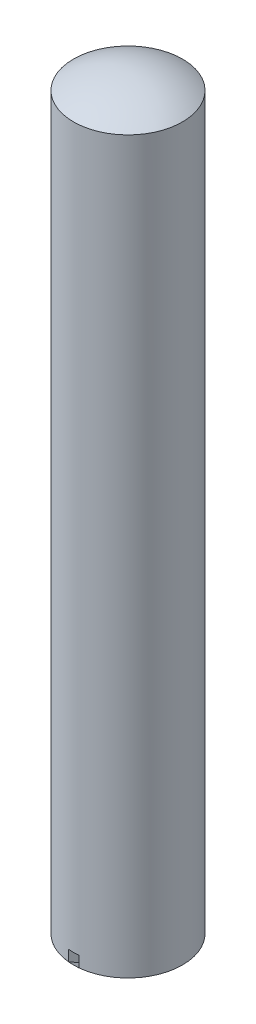
ISO-10303-21;
HEADER;
FILE_DESCRIPTION(('STEP AP214'),'2;1');
FILE_NAME('part.step','',(''),(''),'','','');
FILE_SCHEMA(('AUTOMOTIVE_DESIGN { 1 0 10303 214 1 1 1 1 }'));
ENDSEC;
DATA;
#1=APPLICATION_CONTEXT('core data for automotive mechanical design processes');
#2=APPLICATION_PROTOCOL_DEFINITION('international standard','automotive_design',2000,#1);
#3=PRODUCT_CONTEXT('',#1,'mechanical');
#4=PRODUCT('Part','Part','',(#3));
#5=PRODUCT_RELATED_PRODUCT_CATEGORY('part','',(#4));
#6=PRODUCT_DEFINITION_FORMATION('','',#4);
#7=PRODUCT_DEFINITION_CONTEXT('part definition',#1,'design');
#8=PRODUCT_DEFINITION('design','',#6,#7);
#9=PRODUCT_DEFINITION_SHAPE('','',#8);
#10=(LENGTH_UNIT() NAMED_UNIT(*) SI_UNIT(.MILLI.,.METRE.));
#11=(NAMED_UNIT(*) PLANE_ANGLE_UNIT() SI_UNIT($,.RADIAN.));
#12=(NAMED_UNIT(*) SI_UNIT($,.STERADIAN.) SOLID_ANGLE_UNIT());
#13=UNCERTAINTY_MEASURE_WITH_UNIT(LENGTH_MEASURE(1.E-05),#10,'distance_accuracy_value','');
#14=(GEOMETRIC_REPRESENTATION_CONTEXT(3) GLOBAL_UNCERTAINTY_ASSIGNED_CONTEXT((#13)) GLOBAL_UNIT_ASSIGNED_CONTEXT((#10,
#11,#12)) REPRESENTATION_CONTEXT('',''));
#15=CARTESIAN_POINT('',(0.,0.,0.));
#16=DIRECTION('',(0.,0.,1.));
#17=DIRECTION('',(1.,0.,0.));
#18=AXIS2_PLACEMENT_3D('',#15,#16,#17);
#19=CARTESIAN_POINT('',(0.,5.,0.));
#20=DIRECTION('',(0.,1.,0.));
#21=DIRECTION('',(0.,0.,1.));
#22=AXIS2_PLACEMENT_3D('',#19,#20,#21);
#23=PLANE('',#22);
#24=DIRECTION('',(0.,0.,1.));
#25=VECTOR('',#24,1.);
#26=CARTESIAN_POINT('',(-0.999999999999995,5.,9.9498743710662));
#27=LINE('',#26,#25);
#28=CARTESIAN_POINT('',(-0.999999999999994,5.,-9.9498743710662));
#29=VERTEX_POINT('',#28);
#30=CARTESIAN_POINT('',(-0.999999999999995,5.,9.9498743710662));
#31=VERTEX_POINT('',#30);
#32=EDGE_CURVE('P0_E64',#29,#31,#27,.T.);
#33=ORIENTED_EDGE('',*,*,#32,.F.);
#34=CARTESIAN_POINT('',(0.,5.,0.));
#35=DIRECTION('',(0.,1.,0.));
#36=DIRECTION('',(0.,0.,1.));
#37=AXIS2_PLACEMENT_3D('',#34,#35,#36);
#38=CIRCLE('',#37,10.);
#39=CARTESIAN_POINT('',(0.999999999999997,5.,-9.9498743710662));
#40=VERTEX_POINT('',#39);
#41=EDGE_CURVE('P0_E98',#40,#29,#38,.T.);
#42=ORIENTED_EDGE('',*,*,#41,.F.);
#43=DIRECTION('',(0.,0.,-1.));
#44=VECTOR('',#43,1.);
#45=CARTESIAN_POINT('',(0.999999999999997,5.,9.9498743710662));
#46=LINE('',#45,#44);
#47=CARTESIAN_POINT('',(0.999999999999997,5.,9.9498743710662));
#48=VERTEX_POINT('',#47);
#49=EDGE_CURVE('P0_E118',#48,#40,#46,.T.);
#50=ORIENTED_EDGE('',*,*,#49,.F.);
#51=EDGE_CURVE('P0_E71',#31,#48,#38,.T.);
#52=ORIENTED_EDGE('',*,*,#51,.F.);
#53=EDGE_LOOP('',(#33,#42,#50,#52));
#54=FACE_BOUND('',#53,.T.);
#55=ADVANCED_FACE('P0_F46',(#54),#23,.F.);
#56=CARTESIAN_POINT('',(0.,18.1666666666663,0.));
#57=DIRECTION('',(-1.,0.,0.));
#58=DIRECTION('',(0.,0.,1.));
#59=AXIS2_PLACEMENT_3D('',#56,#57,#58);
#60=SPHERICAL_SURFACE('',#59,18.1666666666663);
#61=CARTESIAN_POINT('',(0.999999999999995,18.1666666666663,0.));
#62=DIRECTION('',(-1.,0.,0.));
#63=DIRECTION('',(0.,-1.,0.));
#64=AXIS2_PLACEMENT_3D('',#61,#62,#63);
#65=CIRCLE('',#64,18.1391228502859);
#66=CARTESIAN_POINT('',(0.999999999999995,3.00000000000008,9.9498743710662));
#67=VERTEX_POINT('',#66);
#68=CARTESIAN_POINT('',(0.999999999999998,3.00000000000008,-9.9498743710662));
#69=VERTEX_POINT('',#68);
#70=EDGE_CURVE('P0_E140',#67,#69,#65,.F.);
#71=ORIENTED_EDGE('',*,*,#70,.T.);
#72=CARTESIAN_POINT('',(0.,3.00000000000009,0.));
#73=DIRECTION('',(0.,1.,0.));
#74=DIRECTION('',(-1.,0.,0.));
#75=AXIS2_PLACEMENT_3D('',#72,#73,#74);
#76=CIRCLE('',#75,10.);
#77=EDGE_CURVE('P0_E51',#67,#69,#76,.T.);
#78=ORIENTED_EDGE('',*,*,#77,.F.);
#79=EDGE_LOOP('',(#71,#78));
#80=FACE_BOUND('',#79,.T.);
#81=ADVANCED_FACE('P0_F48',(#80),#60,.T.);
#82=CARTESIAN_POINT('',(0.,121.833333333334,0.));
#83=DIRECTION('',(-1.,0.,0.));
#84=DIRECTION('',(0.,0.,1.));
#85=AXIS2_PLACEMENT_3D('',#82,#83,#84);
#86=SPHERICAL_SURFACE('',#85,18.1666666666663);
#87=CARTESIAN_POINT('',(0.,137.,0.));
#88=DIRECTION('',(0.,1.,0.));
#89=DIRECTION('',(-1.,0.,0.));
#90=AXIS2_PLACEMENT_3D('',#87,#88,#89);
#91=CIRCLE('',#90,10.);
#92=CARTESIAN_POINT('',(-10.,137.,0.));
#93=VERTEX_POINT('',#92);
#94=EDGE_CURVE('P0_E12',#93,#93,#91,.F.);
#95=ORIENTED_EDGE('',*,*,#94,.F.);
#96=EDGE_LOOP('',(#95));
#97=FACE_BOUND('',#96,.T.);
#98=ADVANCED_FACE('P0_F131',(#97),#86,.T.);
#99=CARTESIAN_POINT('',(0.,3.00000000000006,0.));
#100=DIRECTION('',(0.,1.,0.));
#101=DIRECTION('',(-1.,0.,0.));
#102=AXIS2_PLACEMENT_3D('',#99,#100,#101);
#103=CYLINDRICAL_SURFACE('',#102,10.);
#104=DIRECTION('',(0.,1.,0.));
#105=VECTOR('',#104,1.);
#106=CARTESIAN_POINT('',(0.999999999999997,-0.000999999999996663,-9.9498743710662));
#107=LINE('',#106,#105);
#108=EDGE_CURVE('P0_E141',#69,#40,#107,.T.);
#109=ORIENTED_EDGE('',*,*,#108,.T.);
#110=ORIENTED_EDGE('',*,*,#41,.T.);
#111=DIRECTION('',(0.,1.,0.));
#112=VECTOR('',#111,1.);
#113=CARTESIAN_POINT('',(-0.999999999999994,-0.00100000000000013,-9.9498743710662));
#114=LINE('',#113,#112);
#115=CARTESIAN_POINT('',(-0.999999999999994,3.00000000000007,-9.9498743710662));
#116=VERTEX_POINT('',#115);
#117=EDGE_CURVE('P0_E90',#116,#29,#114,.T.);
#118=ORIENTED_EDGE('',*,*,#117,.F.);
#119=CARTESIAN_POINT('',(0.,3.00000000000009,0.));
#120=DIRECTION('',(0.,1.,0.));
#121=DIRECTION('',(-1.,0.,0.));
#122=AXIS2_PLACEMENT_3D('',#119,#120,#121);
#123=CIRCLE('',#122,10.);
#124=CARTESIAN_POINT('',(-0.999999999999996,3.00000000000009,9.94987437106622));
#125=VERTEX_POINT('',#124);
#126=EDGE_CURVE('P0_E96',#116,#125,#123,.T.);
#127=ORIENTED_EDGE('',*,*,#126,.T.);
#128=DIRECTION('',(0.,1.,0.));
#129=VECTOR('',#128,1.);
#130=CARTESIAN_POINT('',(-0.999999999999995,-0.00100000000000013,9.9498743710662));
#131=LINE('',#130,#129);
#132=EDGE_CURVE('P0_E100',#125,#31,#131,.T.);
#133=ORIENTED_EDGE('',*,*,#132,.T.);
#134=ORIENTED_EDGE('',*,*,#51,.T.);
#135=DIRECTION('',(0.,1.,0.));
#136=VECTOR('',#135,1.);
#137=CARTESIAN_POINT('',(0.999999999999997,-0.000999999999996663,9.9498743710662));
#138=LINE('',#137,#136);
#139=EDGE_CURVE('P0_E106',#67,#48,#138,.T.);
#140=ORIENTED_EDGE('',*,*,#139,.F.);
#141=ORIENTED_EDGE('',*,*,#77,.T.);
#142=EDGE_LOOP('',(#109,#110,#118,#127,#133,#134,#140,#141));
#143=FACE_BOUND('',#142,.T.);
#144=ORIENTED_EDGE('',*,*,#94,.T.);
#145=EDGE_LOOP('',(#144));
#146=FACE_BOUND('',#145,.T.);
#147=ADVANCED_FACE('P0_F93',(#143,#146),#103,.T.);
#148=CARTESIAN_POINT('',(0.999999999999997,-0.000999999999996663,9.9498743710662));
#149=DIRECTION('',(1.,0.,0.));
#150=DIRECTION('',(0.,0.,-1.));
#151=AXIS2_PLACEMENT_3D('',#148,#149,#150);
#152=PLANE('',#151);
#153=ORIENTED_EDGE('',*,*,#70,.F.);
#154=ORIENTED_EDGE('',*,*,#139,.T.);
#155=ORIENTED_EDGE('',*,*,#49,.T.);
#156=ORIENTED_EDGE('',*,*,#108,.F.);
#157=EDGE_LOOP('',(#153,#154,#155,#156));
#158=FACE_BOUND('',#157,.T.);
#159=ADVANCED_FACE('P0_F126',(#158),#152,.F.);
#160=CARTESIAN_POINT('',(-0.999999999999995,-0.00100000000000013,9.9498743710662));
#161=DIRECTION('',(-1.,0.,0.));
#162=DIRECTION('',(0.,0.,1.));
#163=AXIS2_PLACEMENT_3D('',#160,#161,#162);
#164=PLANE('',#163);
#165=CARTESIAN_POINT('',(-0.999999999999995,18.1666666666663,0.));
#166=DIRECTION('',(-1.,0.,0.));
#167=DIRECTION('',(0.,-1.,0.));
#168=AXIS2_PLACEMENT_3D('',#165,#166,#167);
#169=CIRCLE('',#168,18.1391228502859);
#170=EDGE_CURVE('P0_E102',#116,#125,#169,.T.);
#171=ORIENTED_EDGE('',*,*,#170,.F.);
#172=ORIENTED_EDGE('',*,*,#117,.T.);
#173=ORIENTED_EDGE('',*,*,#32,.T.);
#174=ORIENTED_EDGE('',*,*,#132,.F.);
#175=EDGE_LOOP('',(#171,#172,#173,#174));
#176=FACE_BOUND('',#175,.T.);
#177=ADVANCED_FACE('P0_F103',(#176),#164,.F.);
#178=CARTESIAN_POINT('',(0.,18.1666666666663,0.));
#179=DIRECTION('',(-1.,0.,0.));
#180=DIRECTION('',(0.,0.,1.));
#181=AXIS2_PLACEMENT_3D('',#178,#179,#180);
#182=SPHERICAL_SURFACE('',#181,18.1666666666663);
#183=ORIENTED_EDGE('',*,*,#126,.F.);
#184=ORIENTED_EDGE('',*,*,#170,.T.);
#185=EDGE_LOOP('',(#183,#184));
#186=FACE_BOUND('',#185,.T.);
#187=ADVANCED_FACE('P0_F108',(#186),#182,.T.);
#188=CLOSED_SHELL('',(#55,#81,#98,#147,#159,#177,#187));
#189=MANIFOLD_SOLID_BREP('P0_B2',#188);
#190=CARTESIAN_POINT('',(0.,18.1666666666663,0.));
#191=DIRECTION('',(-1.,0.,0.));
#192=DIRECTION('',(0.,0.,1.));
#193=AXIS2_PLACEMENT_3D('',#190,#191,#192);
#194=SPHERICAL_SURFACE('',#193,18.1666666666663);
#195=CARTESIAN_POINT('',(0.,3.00000000000009,0.));
#196=DIRECTION('',(0.,1.,0.));
#197=DIRECTION('',(-1.,0.,0.));
#198=AXIS2_PLACEMENT_3D('',#195,#196,#197);
#199=CIRCLE('',#198,10.);
#200=CARTESIAN_POINT('',(-0.999999999999996,3.00000000000008,-9.94987437106621));
#201=VERTEX_POINT('',#200);
#202=CARTESIAN_POINT('',(-0.999999999999996,3.00000000000009,9.94987437106622));
#203=VERTEX_POINT('',#202);
#204=EDGE_CURVE('P1_E23',#201,#203,#199,.T.);
#205=ORIENTED_EDGE('',*,*,#204,.F.);
#206=CARTESIAN_POINT('',(-0.999999999999995,18.1666666666663,0.));
#207=DIRECTION('',(-1.,0.,0.));
#208=DIRECTION('',(0.,-1.,0.));
#209=AXIS2_PLACEMENT_3D('',#206,#207,#208);
#210=CIRCLE('',#209,18.1391228502859);
#211=EDGE_CURVE('P1_E11',#201,#203,#210,.T.);
#212=ORIENTED_EDGE('',*,*,#211,.T.);
#213=EDGE_LOOP('',(#205,#212));
#214=FACE_BOUND('',#213,.T.);
#215=ADVANCED_FACE('P1_F17',(#214),#194,.T.);
#216=OPEN_SHELL('',(#215));
#217=SHELL_BASED_SURFACE_MODEL('P1_B1',(#216));
#218=CARTESIAN_POINT('',(0.,18.1666666666663,0.));
#219=DIRECTION('',(-1.,0.,0.));
#220=DIRECTION('',(0.,0.,1.));
#221=AXIS2_PLACEMENT_3D('',#218,#219,#220);
#222=SPHERICAL_SURFACE('',#221,18.1666666666663);
#223=CARTESIAN_POINT('',(0.999999999999995,18.1666666666663,0.));
#224=DIRECTION('',(-1.,0.,0.));
#225=DIRECTION('',(0.,-1.,0.));
#226=AXIS2_PLACEMENT_3D('',#223,#224,#225);
#227=CIRCLE('',#226,18.1391228502859);
#228=CARTESIAN_POINT('',(0.999999999999995,3.00000000000008,9.9498743710662));
#229=VERTEX_POINT('',#228);
#230=CARTESIAN_POINT('',(0.999999999999995,3.00000000000008,-9.9498743710662));
#231=VERTEX_POINT('',#230);
#232=EDGE_CURVE('P2_E25',#229,#231,#227,.F.);
#233=ORIENTED_EDGE('',*,*,#232,.F.);
#234=CARTESIAN_POINT('',(0.999999999999995,3.00000000000008,-9.94987437106621));
#235=CARTESIAN_POINT('',(0.720455176498105,2.99999999998639,-9.97797170899275));
#236=CARTESIAN_POINT('',(0.439758357788469,2.99999999995077,-9.99427601842706));
#237=CARTESIAN_POINT('',(-0.122103003394131,2.99999999996703,-10.0032011992398));
#238=CARTESIAN_POINT('',(-0.403267649498535,3.00000000001894,-9.99581583811031));
#239=CARTESIAN_POINT('',(-0.964270930184348,2.99999999998119,-9.95737534371371));
#240=CARTESIAN_POINT('',(-1.24410783193858,2.99999999989139,-9.92629498937105));
#241=CARTESIAN_POINT('',(-1.80017203880382,2.99999999988875,-9.84065621885847));
#242=CARTESIAN_POINT('',(-2.07639927995044,2.99999999997591,-9.78609738722187));
#243=CARTESIAN_POINT('',(-2.62313592520204,3.00000000002424,-9.65392238833417));
#244=CARTESIAN_POINT('',(-2.89364809097162,2.99999999998548,-9.57631764366327));
#245=CARTESIAN_POINT('',(-3.42717660155292,2.99999999998536,-9.39859145246633));
#246=CARTESIAN_POINT('',(-3.69019282792742,3.000000000024,-9.29846965038861));
#247=CARTESIAN_POINT('',(-4.20679080202979,2.99999999997615,-9.07644938488647));
#248=CARTESIAN_POINT('',(-4.46037485615026,2.99999999988968,-8.95455628792818));
#249=CARTESIAN_POINT('',(-4.9563690882471,2.99999999988808,-8.68984603931695));
#250=CARTESIAN_POINT('',(-5.19877950457481,2.99999999997294,-8.54702933426946));
#251=CARTESIAN_POINT('',(-5.67073644388775,3.0000000000272,-8.24146741341947));
#252=CARTESIAN_POINT('',(-5.90028148441317,2.99999999999659,-8.07871990787144));
#253=CARTESIAN_POINT('',(-6.34484590400464,2.99999999998197,-7.73446621135894));
#254=CARTESIAN_POINT('',(-6.55986526835007,2.99999999999797,-7.55296000138448));
#255=CARTESIAN_POINT('',(-6.97385755419765,3.00000000000218,-7.17247196384391));
#256=CARTESIAN_POINT('',(-7.17282985081272,2.99999999999039,-6.97348945636493));
#257=CARTESIAN_POINT('',(-7.55330401533483,2.99999999998928,-6.5594696197685));
#258=CARTESIAN_POINT('',(-7.73480588666227,2.99999999999996,-6.34443229379432));
#259=CARTESIAN_POINT('',(-8.07904562855844,3.00000000000017,-5.89983576332433));
#260=CARTESIAN_POINT('',(-8.24178384749034,2.9999999999897,-5.67027682855713));
#261=CARTESIAN_POINT('',(-8.54734321046001,2.99999999998964,-5.19826551308187));
#262=CARTESIAN_POINT('',(-8.69016435413065,3.00000000000005,-4.95581313213613));
#263=CARTESIAN_POINT('',(-8.95487391917675,3.0000000000001,-4.45973912641554));
#264=CARTESIAN_POINT('',(-9.07676238289923,2.99999999998973,-4.20611752423744));
#265=CARTESIAN_POINT('',(-9.29874038880609,2.99999999998972,-3.68950771300947));
#266=CARTESIAN_POINT('',(-9.3988299310156,3.00000000000008,-3.42651950397041));
#267=CARTESIAN_POINT('',(-9.5764986885193,3.00000000000007,-2.89304565359073));
#268=CARTESIAN_POINT('',(-9.65407786080765,2.99999999998971,-2.6225599979274));
#269=CARTESIAN_POINT('',(-9.7861740800666,2.99999999998971,-2.07601473015084));
#270=CARTESIAN_POINT('',(-9.84069112704379,3.00000000000007,-1.79995511803921));
#271=CARTESIAN_POINT('',(-9.92627543428477,3.00000000000008,-1.24422506114188));
#272=CARTESIAN_POINT('',(-9.95734273686034,2.99999999998972,-0.96455462287232));
#273=CARTESIAN_POINT('',(-9.99580684775477,2.99999999998971,-0.403590710772547));
#274=CARTESIAN_POINT('',(-10.0032036561023,3.00000000000005,-0.122297236944299));
#275=CARTESIAN_POINT('',(-9.99427419011017,3.00000000000005,0.439913027224245));
#276=CARTESIAN_POINT('',(-9.97794790690375,2.99999999998971,0.720829817423714));
#277=CARTESIAN_POINT('',(-9.92168831169758,2.99999999998972,1.28028946121281));
#278=CARTESIAN_POINT('',(-9.88175499966658,3.00000000000008,1.55883231479929));
#279=CARTESIAN_POINT('',(-9.77856519379176,3.00000000000007,2.11156410666457));
#280=CARTESIAN_POINT('',(-9.71530867530531,2.99999999998971,2.38575304034282));
#281=CARTESIAN_POINT('',(-9.56592217815011,2.99999999998971,2.92782736986637));
#282=CARTESIAN_POINT('',(-9.47979219946963,3.00000000000008,3.19571276570844));
#283=CARTESIAN_POINT('',(-9.28527114687885,3.00000000000008,3.72327542676084));
#284=CARTESIAN_POINT('',(-9.17688008022328,2.99999999998971,3.98295269464612));
#285=CARTESIAN_POINT('',(-8.9386074303877,2.99999999998971,4.4922530404908));
#286=CARTESIAN_POINT('',(-8.8087258472234,3.00000000000008,4.74187611845756));
#287=CARTESIAN_POINT('',(-8.52839560179399,3.00000000000008,5.22929331456389));
#288=CARTESIAN_POINT('',(-8.3779469478599,2.99999999998971,5.46708743749492));
#289=CARTESIAN_POINT('',(-8.05755212009854,2.99999999998971,5.92915625887879));
#290=CARTESIAN_POINT('',(-7.88760594627356,3.00000000000007,6.1534309573332));
#291=CARTESIAN_POINT('',(-7.52942426910418,3.00000000000007,6.58686650144421));
#292=CARTESIAN_POINT('',(-7.34118876325015,2.99999999998971,6.79602734502689));
#293=CARTESIAN_POINT('',(-6.94776668305378,2.99999999998971,7.19774813743464));
#294=CARTESIAN_POINT('',(-6.7425801087072,3.00000000000007,7.39030808625554));
#295=CARTESIAN_POINT('',(-6.31671461709335,3.00000000000007,7.75745812743677));
#296=CARTESIAN_POINT('',(-6.09603569780011,2.99999999998971,7.93204821744711));
#297=CARTESIAN_POINT('',(-5.64075443521317,2.99999999998971,8.26201728117313));
#298=CARTESIAN_POINT('',(-5.40615209191899,3.00000000000009,8.41739625488813));
#299=CARTESIAN_POINT('',(-4.92469187398261,3.00000000000009,8.70783842823953));
#300=CARTESIAN_POINT('',(-4.67783399986582,2.99999999998972,8.84290162874689));
#301=CARTESIAN_POINT('',(-4.17361772268155,2.99999999998971,9.09175204517202));
#302=CARTESIAN_POINT('',(-3.91625931961489,3.00000000000007,9.20553926109146));
#303=CARTESIAN_POINT('',(-3.39287166046218,3.00000000000007,9.41102874474887));
#304=CARTESIAN_POINT('',(-3.126842404767,2.99999999998971,9.5027310134824));
#305=CARTESIAN_POINT('',(-2.5880043378677,2.99999999998971,9.66339866123799));
#306=CARTESIAN_POINT('',(-2.31519552666375,3.00000000000007,9.73236404026066));
#307=CARTESIAN_POINT('',(-1.76473785585183,3.00000000000007,9.847067606093));
#308=CARTESIAN_POINT('',(-1.48708899624385,2.99999999998971,9.89280579290267));
#309=CARTESIAN_POINT('',(-0.928925145571508,2.99999999998971,9.96072980322096));
#310=CARTESIAN_POINT('',(-0.648410154507076,3.00000000000007,9.98291562672894));
#311=CARTESIAN_POINT('',(-0.0865083216754144,3.00000000000007,10.0035771830005));
#312=CARTESIAN_POINT('',(0.194878520131116,2.99999999998971,10.0020529146952));
#313=CARTESIAN_POINT('',(0.756523549918357,2.99999999998971,9.97530512136916));
#314=CARTESIAN_POINT('',(1.03678173789898,3.00000000000007,9.95008159634652));
#315=CARTESIAN_POINT('',(1.59417700408445,3.00000000000007,9.87611461215452));
#316=CARTESIAN_POINT('',(1.8713140821555,2.99999999998971,9.82737115197684));
#317=CARTESIAN_POINT('',(2.42049683745347,2.99999999998971,9.7067108338838));
#318=CARTESIAN_POINT('',(2.69254251468057,3.00000000000007,9.63479397596924));
#319=CARTESIAN_POINT('',(3.2296083511173,3.00000000000007,9.46829815914673));
#320=CARTESIAN_POINT('',(3.49462851124568,2.99999999998971,9.37371920320236));
#321=CARTESIAN_POINT('',(4.0157592161213,2.99999999998971,9.16257158499513));
#322=CARTESIAN_POINT('',(4.27186976087077,3.00000000000007,9.04600292273778));
#323=CARTESIAN_POINT('',(4.77336040831721,3.00000000000007,8.79170464259726));
#324=CARTESIAN_POINT('',(5.01874051248658,2.99999999998971,8.65397502761777));
#325=CARTESIAN_POINT('',(5.49702581135635,2.99999999998971,8.35833400503065));
#326=CARTESIAN_POINT('',(5.72993100605529,3.00000000000007,8.20042259742068));
#327=CARTESIAN_POINT('',(6.18161076181444,3.00000000000007,7.86554057670289));
#328=CARTESIAN_POINT('',(6.40038531715078,2.99999999998971,7.68856995587488));
#329=CARTESIAN_POINT('',(6.82224833463069,2.99999999998971,7.31682771665537));
#330=CARTESIAN_POINT('',(7.02533679676279,3.00000000000006,7.12205609825086));
#331=CARTESIAN_POINT('',(7.41438385327075,3.00000000000007,6.71609650782317));
#332=CARTESIAN_POINT('',(7.60034244206409,2.99999999998971,6.50490853045005));
#333=CARTESIAN_POINT('',(7.95380762164634,2.99999999998971,6.06761769921344));
#334=CARTESIAN_POINT('',(8.12131421244471,3.00000000000007,5.84151484535761));
#335=CARTESIAN_POINT('',(8.4366843566206,3.00000000000007,5.37600196482952));
#336=CARTESIAN_POINT('',(8.58454793075224,2.99999999998971,5.13659195221752));
#337=CARTESIAN_POINT('',(8.85958102946629,2.99999999998971,4.64616659633436));
#338=CARTESIAN_POINT('',(8.98675055407609,3.00000000000007,4.39515125307856));
#339=CARTESIAN_POINT('',(9.21949141221788,3.00000000000007,3.8832998982393));
#340=CARTESIAN_POINT('',(9.32506275382233,2.99999999998971,3.62246389032642));
#341=CARTESIAN_POINT('',(9.513856758134,2.99999999998971,3.09282550195079));
#342=CARTESIAN_POINT('',(9.59707942081412,3.00000000000007,2.82402312147837));
#343=CARTESIAN_POINT('',(9.740584534456,3.00000000000007,2.28036251766045));
#344=CARTESIAN_POINT('',(9.80086694402493,2.99999999998973,2.00550428338884));
#345=CARTESIAN_POINT('',(9.898062766396,2.99999999998969,1.45168652185977));
#346=CARTESIAN_POINT('',(9.93497617919145,3.,1.17272699460113));
#347=CARTESIAN_POINT('',(9.98517152736535,3.00000000000001,0.612690421283318));
#348=CARTESIAN_POINT('',(9.99845350789098,2.9999999999897,0.331613379270634));
#349=CARTESIAN_POINT('',(10.0012917032174,2.99999999998974,-0.230660465764563));
#350=CARTESIAN_POINT('',(9.99084791799092,3.0000000000001,-0.511857268787215));
#351=CARTESIAN_POINT('',(9.94630878532794,3.00000000000005,-1.07237206666519));
#352=CARTESIAN_POINT('',(9.91221339004351,2.99999999998964,-1.35169005771847));
#353=CARTESIAN_POINT('',(9.82061338624069,2.99999999998971,-1.90646086223005));
#354=CARTESIAN_POINT('',(9.76310877815381,3.00000000000018,-2.18191367575961));
#355=CARTESIAN_POINT('',(9.62509788983524,2.99999999999997,-2.72700088851753));
#356=CARTESIAN_POINT('',(9.54459118250105,2.99999999998929,-2.9966351796077));
#357=CARTESIAN_POINT('',(9.36114888047885,2.99999999999039,-3.52816310624272));
#358=CARTESIAN_POINT('',(9.25821328139964,3.00000000000218,-3.79005674027207));
#359=CARTESIAN_POINT('',(9.03064948112903,2.99999999999797,-4.30423129843221));
#360=CARTESIAN_POINT('',(8.90602212438244,2.99999999998197,-4.55651259629863));
#361=CARTESIAN_POINT('',(8.63595818822809,2.99999999999658,-5.04967950629771));
#362=CARTESIAN_POINT('',(8.49052162990863,3.0000000000272,-5.29056512997856));
#363=CARTESIAN_POINT('',(8.17989100138895,2.99999999997294,-5.75920150571635));
#364=CARTESIAN_POINT('',(8.01469920482064,2.99999999988807,-5.98695376482991));
#365=CARTESIAN_POINT('',(7.66571516506375,2.99999999988968,-6.42773935214887));
#366=CARTESIAN_POINT('',(7.48192252498122,2.99999999997615,-6.6407723661203));
#367=CARTESIAN_POINT('',(7.0969986059148,3.00000000002401,-7.05065044759193));
#368=CARTESIAN_POINT('',(6.89586306905664,2.99999999998536,-7.24749151647835));
#369=CARTESIAN_POINT('',(6.47772606165378,2.99999999998547,-7.62352437897929));
#370=CARTESIAN_POINT('',(6.26072484170113,3.00000000002423,-7.80271645124769));
#371=CARTESIAN_POINT('',(5.81228522455595,2.9999999999759,-8.1422648268389));
#372=CARTESIAN_POINT('',(5.58083973321306,2.99999999988875,-8.30261176132182));
#373=CARTESIAN_POINT('',(5.10526166499198,2.99999999989139,-8.60322264302552));
#374=CARTESIAN_POINT('',(4.86112931269763,2.99999999998119,-8.74348694558573));
#375=CARTESIAN_POINT('',(4.36217159944598,3.00000000001893,-9.00280056446525));
#376=CARTESIAN_POINT('',(4.10735790074165,2.99999999996703,-9.12187231061287));
#377=CARTESIAN_POINT('',(3.58869501611687,2.99999999995077,-9.33810519468746));
#378=CARTESIAN_POINT('',(3.32484822454037,2.99999999998639,-9.43527208778705));
#379=CARTESIAN_POINT('',(2.72327738568517,3.00000000001717,-9.62843806692209));
#380=CARTESIAN_POINT('',(2.38350831760055,3.00000000000007,-9.71812912061488));
#381=CARTESIAN_POINT('',(1.696425064915,3.00000000000007,-9.86130252573878));
#382=CARTESIAN_POINT('',(1.34911088031406,3.00000000001718,-9.91478487716989));
#383=CARTESIAN_POINT('',(0.999999999999995,3.00000000000008,-9.94987437106621));
#384=B_SPLINE_CURVE_WITH_KNOTS('',3,(#234,#235,#236,#237,#238,#239,#240,#241,#242,#243,#244,
#245,#246,#247,#248,#249,#250,#251,#252,#253,#254,#255,#256,#257,#258,#259,#260,#261,#262,#263,
#264,#265,#266,#267,#268,#269,#270,#271,#272,#273,#274,#275,#276,#277,#278,#279,#280,#281,#282,
#283,#284,#285,#286,#287,#288,#289,#290,#291,#292,#293,#294,#295,#296,#297,#298,#299,#300,#301,
#302,#303,#304,#305,#306,#307,#308,#309,#310,#311,#312,#313,#314,#315,#316,#317,#318,#319,#320,
#321,#322,#323,#324,#325,#326,#327,#328,#329,#330,#331,#332,#333,#334,#335,#336,#337,#338,#339,
#340,#341,#342,#343,#344,#345,#346,#347,#348,#349,#350,#351,#352,#353,#354,#355,#356,#357,#358,
#359,#360,#361,#362,#363,#364,#365,#366,#367,#368,#369,#370,#371,#372,#373,#374,#375,#376,#377,
#378,#379,#380,#381,#382,#383),.UNSPECIFIED.,.T.,.F.,(4,2,2,2,2,2,2,2,2,2,2,2,2,2,2,2,2,2,2,2,2,
2,2,2,2,2,2,2,2,2,2,2,2,2,2,2,2,2,2,2,2,2,2,2,2,2,2,2,2,2,2,2,2,2,2,2,2,2,2,2,2,2,2,2,2,2,2,2,2,
2,2,2,2,2,4),(0.,0.842553479872246,1.68532864505276,2.52900211916044,3.37269052322398,
4.21596145372589,5.05924570068549,5.90232237034645,6.74538104751844,7.5885366703171,
8.43169314757459,9.27488244225743,10.1180715718585,10.9612450444146,11.804418532513,
12.6475903148425,13.4907620961998,14.3339354884176,15.1771088803942,16.0202807509791,
16.863452620541,17.7066248052444,18.5497969910637,19.3929700677568,20.2361431448823,
21.0793159472242,21.9224887489495,22.7656612091356,23.6088336692235,24.4520062450106,
25.2951788210091,26.1383515072721,26.9815241935648,27.8246968437097,28.6678694937889,
29.5110421058587,30.354214717906,31.1973873299533,32.0405599420232,32.8837325921023,
33.7269052422473,34.5700779285399,35.4132506148029,36.2564231908015,37.0995957665885,
37.9427682266765,38.7859406868625,39.6291134885878,40.4722862909298,41.3154593680553,
42.1586324447484,43.0018046305677,43.844976815271,44.6881486848329,45.5313205554178,
46.3744939473944,47.2176673396123,48.0608391209696,48.9040109032991,49.7471843913974,
50.5903578639535,51.4335469935546,52.2767362882374,53.1198927654949,53.9630483882936,
54.8061070654656,55.6491837351266,56.4924679820862,57.3357389125881,58.1794273166516,
59.0231007907593,59.8658759559398,60.7084294358121,61.760656350212,62.812883264612),.UNSPECIFIED.);
#385=EDGE_CURVE('P2_E11',#231,#229,#384,.T.);
#386=ORIENTED_EDGE('',*,*,#385,.F.);
#387=EDGE_LOOP('',(#233,#386));
#388=FACE_BOUND('',#387,.T.);
#389=ADVANCED_FACE('P2_F17',(#388),#222,.T.);
#390=OPEN_SHELL('',(#389));
#391=SHELL_BASED_SURFACE_MODEL('P2_B1',(#390));
#392=ADVANCED_BREP_SHAPE_REPRESENTATION('',(#18,#189),#14);
#393=MANIFOLD_SURFACE_SHAPE_REPRESENTATION('',(#18,#217,#391),#14);
#394=SHAPE_REPRESENTATION('',(#18),#14);
#395=SHAPE_DEFINITION_REPRESENTATION(#9,#394);
#396=SHAPE_REPRESENTATION_RELATIONSHIP('','',#394,#392);
#397=SHAPE_REPRESENTATION_RELATIONSHIP('','',#394,#393);
ENDSEC;
END-ISO-10303-21;
